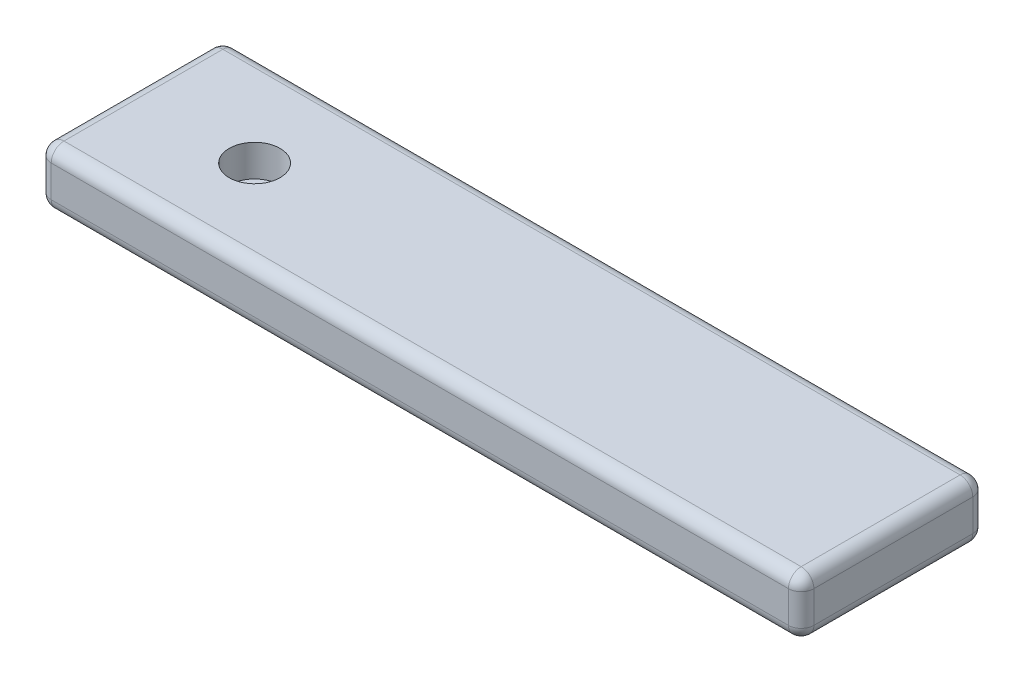
ISO-10303-21;
HEADER;
FILE_DESCRIPTION(('STEP AP214'),'2;1');
FILE_NAME('part.step','',(''),(''),'','','');
FILE_SCHEMA(('AUTOMOTIVE_DESIGN { 1 0 10303 214 1 1 1 1 }'));
ENDSEC;
DATA;
#1=APPLICATION_CONTEXT('core data for automotive mechanical design processes');
#2=APPLICATION_PROTOCOL_DEFINITION('international standard','automotive_design',2000,#1);
#3=PRODUCT_CONTEXT('',#1,'mechanical');
#4=PRODUCT('Part','Part','',(#3));
#5=PRODUCT_RELATED_PRODUCT_CATEGORY('part','',(#4));
#6=PRODUCT_DEFINITION_FORMATION('','',#4);
#7=PRODUCT_DEFINITION_CONTEXT('part definition',#1,'design');
#8=PRODUCT_DEFINITION('design','',#6,#7);
#9=PRODUCT_DEFINITION_SHAPE('','',#8);
#10=(LENGTH_UNIT() NAMED_UNIT(*) SI_UNIT(.MILLI.,.METRE.));
#11=(NAMED_UNIT(*) PLANE_ANGLE_UNIT() SI_UNIT($,.RADIAN.));
#12=(NAMED_UNIT(*) SI_UNIT($,.STERADIAN.) SOLID_ANGLE_UNIT());
#13=UNCERTAINTY_MEASURE_WITH_UNIT(LENGTH_MEASURE(1.E-05),#10,'distance_accuracy_value','');
#14=(GEOMETRIC_REPRESENTATION_CONTEXT(3) GLOBAL_UNCERTAINTY_ASSIGNED_CONTEXT((#13)) GLOBAL_UNIT_ASSIGNED_CONTEXT((#10,
#11,#12)) REPRESENTATION_CONTEXT('',''));
#15=CARTESIAN_POINT('',(0.,0.,0.));
#16=DIRECTION('',(0.,0.,1.));
#17=DIRECTION('',(1.,0.,0.));
#18=AXIS2_PLACEMENT_3D('',#15,#16,#17);
#19=CARTESIAN_POINT('',(76.2,0.,0.));
#20=DIRECTION('',(0.,0.,-1.));
#21=DIRECTION('',(-1.,0.,0.));
#22=AXIS2_PLACEMENT_3D('',#19,#20,#21);
#23=PLANE('',#22);
#24=DIRECTION('',(0.,-1.,0.));
#25=VECTOR('',#24,1.);
#26=CARTESIAN_POINT('',(74.93,0.,0.));
#27=LINE('',#26,#25);
#28=CARTESIAN_POINT('',(74.93,1.27,0.));
#29=VERTEX_POINT('',#28);
#30=CARTESIAN_POINT('',(74.93,4.445,0.));
#31=VERTEX_POINT('',#30);
#32=EDGE_CURVE('E166',#29,#31,#27,.F.);
#33=ORIENTED_EDGE('',*,*,#32,.T.);
#34=DIRECTION('',(-1.,0.,0.));
#35=VECTOR('',#34,1.);
#36=CARTESIAN_POINT('',(76.2,4.445,0.));
#37=LINE('',#36,#35);
#38=CARTESIAN_POINT('',(1.26999999999999,4.445,0.));
#39=VERTEX_POINT('',#38);
#40=EDGE_CURVE('E271',#31,#39,#37,.T.);
#41=ORIENTED_EDGE('',*,*,#40,.T.);
#42=DIRECTION('',(0.,-1.,0.));
#43=VECTOR('',#42,1.);
#44=CARTESIAN_POINT('',(1.26999999999999,0.,0.));
#45=LINE('',#44,#43);
#46=CARTESIAN_POINT('',(1.26999999999999,1.27,0.));
#47=VERTEX_POINT('',#46);
#48=EDGE_CURVE('E266',#39,#47,#45,.T.);
#49=ORIENTED_EDGE('',*,*,#48,.T.);
#50=DIRECTION('',(-1.,0.,0.));
#51=VECTOR('',#50,1.);
#52=CARTESIAN_POINT('',(76.2,1.27,0.));
#53=LINE('',#52,#51);
#54=EDGE_CURVE('E263',#47,#29,#53,.F.);
#55=ORIENTED_EDGE('',*,*,#54,.T.);
#56=EDGE_LOOP('',(#33,#41,#49,#55));
#57=FACE_BOUND('',#56,.T.);
#58=ADVANCED_FACE('F44',(#57),#23,.F.);
#59=CARTESIAN_POINT('',(76.2,0.,0.));
#60=DIRECTION('',(0.,1.,0.));
#61=DIRECTION('',(0.,0.,1.));
#62=AXIS2_PLACEMENT_3D('',#59,#60,#61);
#63=PLANE('',#62);
#64=DIRECTION('',(0.,0.,-1.));
#65=VECTOR('',#64,1.);
#66=CARTESIAN_POINT('',(74.93,0.,0.));
#67=LINE('',#66,#65);
#68=CARTESIAN_POINT('',(74.93,0.,-17.145));
#69=VERTEX_POINT('',#68);
#70=CARTESIAN_POINT('',(74.93,0.,-1.27));
#71=VERTEX_POINT('',#70);
#72=EDGE_CURVE('E54',#69,#71,#67,.F.);
#73=ORIENTED_EDGE('',*,*,#72,.T.);
#74=DIRECTION('',(-1.,0.,0.));
#75=VECTOR('',#74,1.);
#76=CARTESIAN_POINT('',(76.2,0.,-1.27));
#77=LINE('',#76,#75);
#78=CARTESIAN_POINT('',(1.26999999999999,0.,-1.27));
#79=VERTEX_POINT('',#78);
#80=EDGE_CURVE('E11',#71,#79,#77,.T.);
#81=ORIENTED_EDGE('',*,*,#80,.T.);
#82=DIRECTION('',(0.,0.,-1.));
#83=VECTOR('',#82,1.);
#84=CARTESIAN_POINT('',(1.26999999999999,0.,-18.415));
#85=LINE('',#84,#83);
#86=CARTESIAN_POINT('',(1.26999999999999,0.,-17.145));
#87=VERTEX_POINT('',#86);
#88=EDGE_CURVE('E302',#79,#87,#85,.T.);
#89=ORIENTED_EDGE('',*,*,#88,.T.);
#90=DIRECTION('',(-1.,0.,0.));
#91=VECTOR('',#90,1.);
#92=CARTESIAN_POINT('',(76.2,0.,-17.145));
#93=LINE('',#92,#91);
#94=EDGE_CURVE('E67',#87,#69,#93,.F.);
#95=ORIENTED_EDGE('',*,*,#94,.T.);
#96=EDGE_LOOP('',(#73,#81,#89,#95));
#97=FACE_BOUND('',#96,.T.);
#98=ADVANCED_FACE('F358',(#97),#63,.F.);
#99=CARTESIAN_POINT('',(76.2,0.,-18.415));
#100=DIRECTION('',(0.,0.,1.));
#101=DIRECTION('',(1.,0.,0.));
#102=AXIS2_PLACEMENT_3D('',#99,#100,#101);
#103=PLANE('',#102);
#104=DIRECTION('',(-1.,0.,0.));
#105=VECTOR('',#104,1.);
#106=CARTESIAN_POINT('',(76.2,4.445,-18.415));
#107=LINE('',#106,#105);
#108=CARTESIAN_POINT('',(1.26999999999999,4.445,-18.415));
#109=VERTEX_POINT('',#108);
#110=CARTESIAN_POINT('',(74.93,4.445,-18.415));
#111=VERTEX_POINT('',#110);
#112=EDGE_CURVE('E294',#109,#111,#107,.F.);
#113=ORIENTED_EDGE('',*,*,#112,.T.);
#114=DIRECTION('',(0.,1.,0.));
#115=VECTOR('',#114,1.);
#116=CARTESIAN_POINT('',(74.93,0.,-18.415));
#117=LINE('',#116,#115);
#118=CARTESIAN_POINT('',(74.93,1.27,-18.415));
#119=VERTEX_POINT('',#118);
#120=EDGE_CURVE('E299',#111,#119,#117,.F.);
#121=ORIENTED_EDGE('',*,*,#120,.T.);
#122=DIRECTION('',(-1.,0.,0.));
#123=VECTOR('',#122,1.);
#124=CARTESIAN_POINT('',(76.2,1.27,-18.415));
#125=LINE('',#124,#123);
#126=CARTESIAN_POINT('',(1.26999999999999,1.27,-18.415));
#127=VERTEX_POINT('',#126);
#128=EDGE_CURVE('E288',#119,#127,#125,.T.);
#129=ORIENTED_EDGE('',*,*,#128,.T.);
#130=DIRECTION('',(0.,1.,0.));
#131=VECTOR('',#130,1.);
#132=CARTESIAN_POINT('',(1.26999999999999,5.715,-18.415));
#133=LINE('',#132,#131);
#134=EDGE_CURVE('E292',#127,#109,#133,.T.);
#135=ORIENTED_EDGE('',*,*,#134,.T.);
#136=EDGE_LOOP('',(#113,#121,#129,#135));
#137=FACE_BOUND('',#136,.T.);
#138=ADVANCED_FACE('F372',(#137),#103,.F.);
#139=CARTESIAN_POINT('',(76.2,5.715,0.));
#140=DIRECTION('',(0.,-1.,0.));
#141=DIRECTION('',(0.,0.,-1.));
#142=AXIS2_PLACEMENT_3D('',#139,#140,#141);
#143=PLANE('',#142);
#144=DIRECTION('',(-1.,0.,0.));
#145=VECTOR('',#144,1.);
#146=CARTESIAN_POINT('',(76.2,5.715,-1.27));
#147=LINE('',#146,#145);
#148=CARTESIAN_POINT('',(1.26999999999999,5.715,-1.27));
#149=VERTEX_POINT('',#148);
#150=CARTESIAN_POINT('',(74.93,5.715,-1.27));
#151=VERTEX_POINT('',#150);
#152=EDGE_CURVE('E258',#149,#151,#147,.F.);
#153=ORIENTED_EDGE('',*,*,#152,.T.);
#154=DIRECTION('',(0.,0.,1.));
#155=VECTOR('',#154,1.);
#156=CARTESIAN_POINT('',(74.93,5.715,0.));
#157=LINE('',#156,#155);
#158=CARTESIAN_POINT('',(74.93,5.715,-17.145));
#159=VERTEX_POINT('',#158);
#160=EDGE_CURVE('E259',#151,#159,#157,.F.);
#161=ORIENTED_EDGE('',*,*,#160,.T.);
#162=DIRECTION('',(-1.,0.,0.));
#163=VECTOR('',#162,1.);
#164=CARTESIAN_POINT('',(76.2,5.715,-17.145));
#165=LINE('',#164,#163);
#166=CARTESIAN_POINT('',(1.26999999999999,5.715,-17.145));
#167=VERTEX_POINT('',#166);
#168=EDGE_CURVE('E246',#159,#167,#165,.T.);
#169=ORIENTED_EDGE('',*,*,#168,.T.);
#170=DIRECTION('',(0.,0.,1.));
#171=VECTOR('',#170,1.);
#172=CARTESIAN_POINT('',(1.26999999999999,5.715,0.));
#173=LINE('',#172,#171);
#174=EDGE_CURVE('E251',#167,#149,#173,.T.);
#175=ORIENTED_EDGE('',*,*,#174,.T.);
#176=EDGE_LOOP('',(#153,#161,#169,#175));
#177=FACE_BOUND('',#176,.T.);
#178=CARTESIAN_POINT('',(12.7,5.715,-8.89));
#179=DIRECTION('',(0.,1.,0.));
#180=DIRECTION('',(0.,0.,1.));
#181=AXIS2_PLACEMENT_3D('',#178,#179,#180);
#182=CIRCLE('',#181,2.54);
#183=CARTESIAN_POINT('',(12.7,5.715,-6.35));
#184=VERTEX_POINT('',#183);
#185=EDGE_CURVE('E235',#184,#184,#182,.T.);
#186=ORIENTED_EDGE('',*,*,#185,.F.);
#187=EDGE_LOOP('',(#186));
#188=FACE_BOUND('',#187,.T.);
#189=ADVANCED_FACE('F338',(#177,#188),#143,.F.);
#190=CARTESIAN_POINT('',(76.2,0.,0.));
#191=DIRECTION('',(-1.,0.,0.));
#192=DIRECTION('',(0.,0.,1.));
#193=AXIS2_PLACEMENT_3D('',#190,#191,#192);
#194=PLANE('',#193);
#195=DIRECTION('',(0.,1.,0.));
#196=VECTOR('',#195,1.);
#197=CARTESIAN_POINT('',(76.2,0.,-17.145));
#198=LINE('',#197,#196);
#199=CARTESIAN_POINT('',(76.2,1.27,-17.145));
#200=VERTEX_POINT('',#199);
#201=CARTESIAN_POINT('',(76.2,4.445,-17.145));
#202=VERTEX_POINT('',#201);
#203=EDGE_CURVE('E144',#200,#202,#198,.T.);
#204=ORIENTED_EDGE('',*,*,#203,.T.);
#205=DIRECTION('',(0.,0.,1.));
#206=VECTOR('',#205,1.);
#207=CARTESIAN_POINT('',(76.2,4.445,0.));
#208=LINE('',#207,#206);
#209=CARTESIAN_POINT('',(76.2,4.445,-1.27));
#210=VERTEX_POINT('',#209);
#211=EDGE_CURVE('E136',#202,#210,#208,.T.);
#212=ORIENTED_EDGE('',*,*,#211,.T.);
#213=DIRECTION('',(0.,-1.,0.));
#214=VECTOR('',#213,1.);
#215=CARTESIAN_POINT('',(76.2,0.,-1.27));
#216=LINE('',#215,#214);
#217=CARTESIAN_POINT('',(76.2,1.27,-1.27));
#218=VERTEX_POINT('',#217);
#219=EDGE_CURVE('E131',#210,#218,#216,.T.);
#220=ORIENTED_EDGE('',*,*,#219,.T.);
#221=DIRECTION('',(0.,0.,-1.));
#222=VECTOR('',#221,1.);
#223=CARTESIAN_POINT('',(76.2,1.27,0.));
#224=LINE('',#223,#222);
#225=EDGE_CURVE('E140',#218,#200,#224,.T.);
#226=ORIENTED_EDGE('',*,*,#225,.T.);
#227=EDGE_LOOP('',(#204,#212,#220,#226));
#228=FACE_BOUND('',#227,.T.);
#229=ADVANCED_FACE('F137',(#228),#194,.F.);
#230=CARTESIAN_POINT('',(0.,0.,0.));
#231=DIRECTION('',(-1.,0.,0.));
#232=DIRECTION('',(0.,0.,1.));
#233=AXIS2_PLACEMENT_3D('',#230,#231,#232);
#234=PLANE('',#233);
#235=DIRECTION('',(0.,-1.,0.));
#236=VECTOR('',#235,1.);
#237=CARTESIAN_POINT('',(0.,5.715,-1.27));
#238=LINE('',#237,#236);
#239=CARTESIAN_POINT('',(0.,1.27,-1.27));
#240=VERTEX_POINT('',#239);
#241=CARTESIAN_POINT('',(0.,4.445,-1.27));
#242=VERTEX_POINT('',#241);
#243=EDGE_CURVE('E282',#240,#242,#238,.F.);
#244=ORIENTED_EDGE('',*,*,#243,.T.);
#245=DIRECTION('',(0.,0.,1.));
#246=VECTOR('',#245,1.);
#247=CARTESIAN_POINT('',(0.,4.445,-18.415));
#248=LINE('',#247,#246);
#249=CARTESIAN_POINT('',(0.,4.445,-17.145));
#250=VERTEX_POINT('',#249);
#251=EDGE_CURVE('E281',#242,#250,#248,.F.);
#252=ORIENTED_EDGE('',*,*,#251,.T.);
#253=DIRECTION('',(0.,1.,0.));
#254=VECTOR('',#253,1.);
#255=CARTESIAN_POINT('',(0.,0.,-17.145));
#256=LINE('',#255,#254);
#257=CARTESIAN_POINT('',(0.,1.27,-17.145));
#258=VERTEX_POINT('',#257);
#259=EDGE_CURVE('E279',#250,#258,#256,.F.);
#260=ORIENTED_EDGE('',*,*,#259,.T.);
#261=DIRECTION('',(0.,0.,-1.));
#262=VECTOR('',#261,1.);
#263=CARTESIAN_POINT('',(0.,1.27,0.));
#264=LINE('',#263,#262);
#265=EDGE_CURVE('E274',#258,#240,#264,.F.);
#266=ORIENTED_EDGE('',*,*,#265,.T.);
#267=EDGE_LOOP('',(#244,#252,#260,#266));
#268=FACE_BOUND('',#267,.T.);
#269=ADVANCED_FACE('F572',(#268),#234,.T.);
#270=CARTESIAN_POINT('',(12.7,2.54,-8.89));
#271=DIRECTION('',(0.,1.,0.));
#272=DIRECTION('',(0.,0.,1.));
#273=AXIS2_PLACEMENT_3D('',#270,#271,#272);
#274=CYLINDRICAL_SURFACE('',#273,2.54);
#275=CARTESIAN_POINT('',(12.7,2.54,-8.89));
#276=DIRECTION('',(0.,1.,0.));
#277=DIRECTION('',(0.,0.,1.));
#278=AXIS2_PLACEMENT_3D('',#275,#276,#277);
#279=CIRCLE('',#278,2.54);
#280=CARTESIAN_POINT('',(12.7,2.54,-6.35));
#281=VERTEX_POINT('',#280);
#282=EDGE_CURVE('E160',#281,#281,#279,.T.);
#283=ORIENTED_EDGE('',*,*,#282,.F.);
#284=EDGE_LOOP('',(#283));
#285=FACE_BOUND('',#284,.T.);
#286=ORIENTED_EDGE('',*,*,#185,.T.);
#287=EDGE_LOOP('',(#286));
#288=FACE_BOUND('',#287,.T.);
#289=ADVANCED_FACE('F565',(#285,#288),#274,.F.);
#290=CARTESIAN_POINT('',(12.7,2.54,-8.89));
#291=DIRECTION('',(0.,1.,0.));
#292=DIRECTION('',(0.,0.,1.));
#293=AXIS2_PLACEMENT_3D('',#290,#291,#292);
#294=PLANE('',#293);
#295=ORIENTED_EDGE('',*,*,#282,.T.);
#296=EDGE_LOOP('',(#295));
#297=FACE_BOUND('',#296,.T.);
#298=ADVANCED_FACE('F557',(#297),#294,.T.);
#299=CARTESIAN_POINT('',(1.26999999999999,1.27,0.));
#300=DIRECTION('',(0.,0.,1.));
#301=DIRECTION('',(1.,0.,0.));
#302=AXIS2_PLACEMENT_3D('',#299,#300,#301);
#303=CYLINDRICAL_SURFACE('',#302,1.27);
#304=CARTESIAN_POINT('',(1.26999999999999,1.27,-17.145));
#305=DIRECTION('',(0.,0.,-1.));
#306=DIRECTION('',(-1.,0.,0.));
#307=AXIS2_PLACEMENT_3D('',#304,#305,#306);
#308=CIRCLE('',#307,1.27);
#309=EDGE_CURVE('E47',#87,#258,#308,.T.);
#310=ORIENTED_EDGE('',*,*,#309,.F.);
#311=ORIENTED_EDGE('',*,*,#88,.F.);
#312=CARTESIAN_POINT('',(1.27,1.27,-1.27));
#313=DIRECTION('',(0.,0.,1.));
#314=DIRECTION('',(0.,-1.,0.));
#315=AXIS2_PLACEMENT_3D('',#312,#313,#314);
#316=CIRCLE('',#315,1.27);
#317=EDGE_CURVE('E225',#240,#79,#316,.T.);
#318=ORIENTED_EDGE('',*,*,#317,.F.);
#319=ORIENTED_EDGE('',*,*,#265,.F.);
#320=EDGE_LOOP('',(#310,#311,#318,#319));
#321=FACE_BOUND('',#320,.T.);
#322=ADVANCED_FACE('F50',(#321),#303,.T.);
#323=CARTESIAN_POINT('',(1.27,1.27,-17.145));
#324=DIRECTION('',(-1.,0.,0.));
#325=DIRECTION('',(0.,0.,1.));
#326=AXIS2_PLACEMENT_3D('',#323,#324,#325);
#327=SPHERICAL_SURFACE('',#326,1.27);
#328=CARTESIAN_POINT('',(1.26999999999999,1.27,-17.145));
#329=DIRECTION('',(-1.,0.,0.));
#330=DIRECTION('',(0.,0.,1.));
#331=AXIS2_PLACEMENT_3D('',#328,#329,#330);
#332=CIRCLE('',#331,1.27);
#333=EDGE_CURVE('E214',#87,#127,#332,.F.);
#334=ORIENTED_EDGE('',*,*,#333,.F.);
#335=ORIENTED_EDGE('',*,*,#309,.T.);
#336=CARTESIAN_POINT('',(1.27,1.27,-17.145));
#337=DIRECTION('',(0.,-1.,0.));
#338=DIRECTION('',(0.,0.,-1.));
#339=AXIS2_PLACEMENT_3D('',#336,#337,#338);
#340=CIRCLE('',#339,1.27);
#341=EDGE_CURVE('E218',#127,#258,#340,.F.);
#342=ORIENTED_EDGE('',*,*,#341,.F.);
#343=EDGE_LOOP('',(#334,#335,#342));
#344=FACE_BOUND('',#343,.T.);
#345=ADVANCED_FACE('F363',(#344),#327,.T.);
#346=CARTESIAN_POINT('',(1.27,1.27,-1.27));
#347=DIRECTION('',(0.,-1.,0.));
#348=DIRECTION('',(1.,0.,0.));
#349=AXIS2_PLACEMENT_3D('',#346,#347,#348);
#350=SPHERICAL_SURFACE('',#349,1.27);
#351=CARTESIAN_POINT('',(1.26999999999999,1.27,-1.27));
#352=DIRECTION('',(0.,-1.,0.));
#353=DIRECTION('',(0.,0.,-1.));
#354=AXIS2_PLACEMENT_3D('',#351,#352,#353);
#355=CIRCLE('',#354,1.27);
#356=EDGE_CURVE('E208',#240,#47,#355,.F.);
#357=ORIENTED_EDGE('',*,*,#356,.F.);
#358=ORIENTED_EDGE('',*,*,#317,.T.);
#359=CARTESIAN_POINT('',(1.26999999999999,1.27,-1.27));
#360=DIRECTION('',(-1.,0.,0.));
#361=DIRECTION('',(0.,0.,1.));
#362=AXIS2_PLACEMENT_3D('',#359,#360,#361);
#363=CIRCLE('',#362,1.27);
#364=EDGE_CURVE('E215',#47,#79,#363,.F.);
#365=ORIENTED_EDGE('',*,*,#364,.F.);
#366=EDGE_LOOP('',(#357,#358,#365));
#367=FACE_BOUND('',#366,.T.);
#368=ADVANCED_FACE('F394',(#367),#350,.T.);
#369=CARTESIAN_POINT('',(1.26999999999999,0.,-17.145));
#370=DIRECTION('',(0.,-1.,0.));
#371=DIRECTION('',(0.,0.,-1.));
#372=AXIS2_PLACEMENT_3D('',#369,#370,#371);
#373=CYLINDRICAL_SURFACE('',#372,1.27);
#374=ORIENTED_EDGE('',*,*,#341,.T.);
#375=ORIENTED_EDGE('',*,*,#259,.F.);
#376=CARTESIAN_POINT('',(1.26999999999999,4.445,-17.145));
#377=DIRECTION('',(0.,1.,0.));
#378=DIRECTION('',(0.,0.,1.));
#379=AXIS2_PLACEMENT_3D('',#376,#377,#378);
#380=CIRCLE('',#379,1.27);
#381=EDGE_CURVE('E203',#109,#250,#380,.T.);
#382=ORIENTED_EDGE('',*,*,#381,.F.);
#383=ORIENTED_EDGE('',*,*,#134,.F.);
#384=EDGE_LOOP('',(#374,#375,#382,#383));
#385=FACE_BOUND('',#384,.T.);
#386=ADVANCED_FACE('F378',(#385),#373,.T.);
#387=CARTESIAN_POINT('',(76.2,1.27,-17.145));
#388=DIRECTION('',(-1.,0.,0.));
#389=DIRECTION('',(0.,0.,1.));
#390=AXIS2_PLACEMENT_3D('',#387,#388,#389);
#391=CYLINDRICAL_SURFACE('',#390,1.27);
#392=ORIENTED_EDGE('',*,*,#333,.T.);
#393=ORIENTED_EDGE('',*,*,#128,.F.);
#394=CARTESIAN_POINT('',(74.93,1.27,-17.145));
#395=DIRECTION('',(1.,0.,0.));
#396=DIRECTION('',(0.,0.,-1.));
#397=AXIS2_PLACEMENT_3D('',#394,#395,#396);
#398=CIRCLE('',#397,1.27);
#399=EDGE_CURVE('E197',#69,#119,#398,.T.);
#400=ORIENTED_EDGE('',*,*,#399,.F.);
#401=ORIENTED_EDGE('',*,*,#94,.F.);
#402=EDGE_LOOP('',(#392,#393,#400,#401));
#403=FACE_BOUND('',#402,.T.);
#404=ADVANCED_FACE('F368',(#403),#391,.T.);
#405=CARTESIAN_POINT('',(74.93,1.27,0.));
#406=DIRECTION('',(0.,0.,-1.));
#407=DIRECTION('',(-1.,0.,0.));
#408=AXIS2_PLACEMENT_3D('',#405,#406,#407);
#409=CYLINDRICAL_SURFACE('',#408,1.27);
#410=CARTESIAN_POINT('',(74.93,1.27,-1.27));
#411=DIRECTION('',(0.,0.,1.));
#412=DIRECTION('',(1.,0.,0.));
#413=AXIS2_PLACEMENT_3D('',#410,#411,#412);
#414=CIRCLE('',#413,1.27);
#415=EDGE_CURVE('E151',#71,#218,#414,.T.);
#416=ORIENTED_EDGE('',*,*,#415,.F.);
#417=ORIENTED_EDGE('',*,*,#72,.F.);
#418=CARTESIAN_POINT('',(74.93,1.27,-17.145));
#419=DIRECTION('',(0.,0.,-1.));
#420=DIRECTION('',(-1.,0.,0.));
#421=AXIS2_PLACEMENT_3D('',#418,#419,#420);
#422=CIRCLE('',#421,1.27);
#423=EDGE_CURVE('E152',#200,#69,#422,.T.);
#424=ORIENTED_EDGE('',*,*,#423,.F.);
#425=ORIENTED_EDGE('',*,*,#225,.F.);
#426=EDGE_LOOP('',(#416,#417,#424,#425));
#427=FACE_BOUND('',#426,.T.);
#428=ADVANCED_FACE('F147',(#427),#409,.T.);
#429=CARTESIAN_POINT('',(76.2,1.27,-1.27));
#430=DIRECTION('',(-1.,0.,0.));
#431=DIRECTION('',(0.,0.,1.));
#432=AXIS2_PLACEMENT_3D('',#429,#430,#431);
#433=CYLINDRICAL_SURFACE('',#432,1.27);
#434=ORIENTED_EDGE('',*,*,#364,.T.);
#435=ORIENTED_EDGE('',*,*,#80,.F.);
#436=CARTESIAN_POINT('',(74.93,1.27,-1.27));
#437=DIRECTION('',(1.,0.,0.));
#438=DIRECTION('',(0.,0.,-1.));
#439=AXIS2_PLACEMENT_3D('',#436,#437,#438);
#440=CIRCLE('',#439,1.27);
#441=EDGE_CURVE('E164',#29,#71,#440,.T.);
#442=ORIENTED_EDGE('',*,*,#441,.F.);
#443=ORIENTED_EDGE('',*,*,#54,.F.);
#444=EDGE_LOOP('',(#434,#435,#442,#443));
#445=FACE_BOUND('',#444,.T.);
#446=ADVANCED_FACE('F360',(#445),#433,.T.);
#447=CARTESIAN_POINT('',(1.26999999999999,0.,-1.27));
#448=DIRECTION('',(0.,1.,0.));
#449=DIRECTION('',(0.,0.,1.));
#450=AXIS2_PLACEMENT_3D('',#447,#448,#449);
#451=CYLINDRICAL_SURFACE('',#450,1.27);
#452=ORIENTED_EDGE('',*,*,#356,.T.);
#453=ORIENTED_EDGE('',*,*,#48,.F.);
#454=CARTESIAN_POINT('',(1.27,4.445,-1.27));
#455=DIRECTION('',(0.,1.,0.));
#456=DIRECTION('',(0.,0.,1.));
#457=AXIS2_PLACEMENT_3D('',#454,#455,#456);
#458=CIRCLE('',#457,1.27);
#459=EDGE_CURVE('E186',#242,#39,#458,.T.);
#460=ORIENTED_EDGE('',*,*,#459,.F.);
#461=ORIENTED_EDGE('',*,*,#243,.F.);
#462=EDGE_LOOP('',(#452,#453,#460,#461));
#463=FACE_BOUND('',#462,.T.);
#464=ADVANCED_FACE('F392',(#463),#451,.T.);
#465=CARTESIAN_POINT('',(1.26999999999999,4.445,0.));
#466=DIRECTION('',(0.,0.,-1.));
#467=DIRECTION('',(-1.,0.,0.));
#468=AXIS2_PLACEMENT_3D('',#465,#466,#467);
#469=CYLINDRICAL_SURFACE('',#468,1.27);
#470=CARTESIAN_POINT('',(1.27,4.445,-17.145));
#471=DIRECTION('',(0.,0.,-1.));
#472=DIRECTION('',(0.,1.,0.));
#473=AXIS2_PLACEMENT_3D('',#470,#471,#472);
#474=CIRCLE('',#473,1.27);
#475=EDGE_CURVE('E204',#250,#167,#474,.T.);
#476=ORIENTED_EDGE('',*,*,#475,.F.);
#477=ORIENTED_EDGE('',*,*,#251,.F.);
#478=CARTESIAN_POINT('',(1.26999999999999,4.445,-1.27));
#479=DIRECTION('',(0.,0.,1.));
#480=DIRECTION('',(1.,0.,0.));
#481=AXIS2_PLACEMENT_3D('',#478,#479,#480);
#482=CIRCLE('',#481,1.27);
#483=EDGE_CURVE('E183',#149,#242,#482,.T.);
#484=ORIENTED_EDGE('',*,*,#483,.F.);
#485=ORIENTED_EDGE('',*,*,#174,.F.);
#486=EDGE_LOOP('',(#476,#477,#484,#485));
#487=FACE_BOUND('',#486,.T.);
#488=ADVANCED_FACE('F383',(#487),#469,.T.);
#489=CARTESIAN_POINT('',(1.27,4.445,-17.145));
#490=DIRECTION('',(-1.,0.,0.));
#491=DIRECTION('',(0.,0.,1.));
#492=AXIS2_PLACEMENT_3D('',#489,#490,#491);
#493=SPHERICAL_SURFACE('',#492,1.27);
#494=ORIENTED_EDGE('',*,*,#381,.T.);
#495=ORIENTED_EDGE('',*,*,#475,.T.);
#496=CARTESIAN_POINT('',(1.26999999999999,4.445,-17.145));
#497=DIRECTION('',(-1.,0.,0.));
#498=DIRECTION('',(0.,0.,1.));
#499=AXIS2_PLACEMENT_3D('',#496,#497,#498);
#500=CIRCLE('',#499,1.27);
#501=EDGE_CURVE('E177',#109,#167,#500,.F.);
#502=ORIENTED_EDGE('',*,*,#501,.F.);
#503=EDGE_LOOP('',(#494,#495,#502));
#504=FACE_BOUND('',#503,.T.);
#505=ADVANCED_FACE('F381',(#504),#493,.T.);
#506=CARTESIAN_POINT('',(74.93,1.27,-17.145));
#507=DIRECTION('',(0.,-1.,0.));
#508=DIRECTION('',(0.,0.,-1.));
#509=AXIS2_PLACEMENT_3D('',#506,#507,#508);
#510=SPHERICAL_SURFACE('',#509,1.27);
#511=ORIENTED_EDGE('',*,*,#423,.T.);
#512=ORIENTED_EDGE('',*,*,#399,.T.);
#513=CARTESIAN_POINT('',(74.93,1.27,-17.145));
#514=DIRECTION('',(0.,-1.,0.));
#515=DIRECTION('',(1.,0.,0.));
#516=AXIS2_PLACEMENT_3D('',#513,#514,#515);
#517=CIRCLE('',#516,1.27);
#518=EDGE_CURVE('E172',#200,#119,#517,.F.);
#519=ORIENTED_EDGE('',*,*,#518,.F.);
#520=EDGE_LOOP('',(#511,#512,#519));
#521=FACE_BOUND('',#520,.T.);
#522=ADVANCED_FACE('F366',(#521),#510,.T.);
#523=CARTESIAN_POINT('',(74.93,1.27,-1.27));
#524=DIRECTION('',(0.,-1.,0.));
#525=DIRECTION('',(0.,0.,-1.));
#526=AXIS2_PLACEMENT_3D('',#523,#524,#525);
#527=SPHERICAL_SURFACE('',#526,1.27);
#528=ORIENTED_EDGE('',*,*,#441,.T.);
#529=ORIENTED_EDGE('',*,*,#415,.T.);
#530=CARTESIAN_POINT('',(74.93,1.27,-1.27));
#531=DIRECTION('',(0.,-1.,0.));
#532=DIRECTION('',(0.,0.,-1.));
#533=AXIS2_PLACEMENT_3D('',#530,#531,#532);
#534=CIRCLE('',#533,1.27);
#535=EDGE_CURVE('E165',#29,#218,#534,.F.);
#536=ORIENTED_EDGE('',*,*,#535,.F.);
#537=EDGE_LOOP('',(#528,#529,#536));
#538=FACE_BOUND('',#537,.T.);
#539=ADVANCED_FACE('F161',(#538),#527,.T.);
#540=CARTESIAN_POINT('',(1.27,4.445,-1.27));
#541=DIRECTION('',(-1.,0.,0.));
#542=DIRECTION('',(0.,0.,1.));
#543=AXIS2_PLACEMENT_3D('',#540,#541,#542);
#544=SPHERICAL_SURFACE('',#543,1.27);
#545=ORIENTED_EDGE('',*,*,#483,.T.);
#546=ORIENTED_EDGE('',*,*,#459,.T.);
#547=CARTESIAN_POINT('',(1.26999999999999,4.445,-1.27));
#548=DIRECTION('',(-1.,0.,0.));
#549=DIRECTION('',(0.,0.,1.));
#550=AXIS2_PLACEMENT_3D('',#547,#548,#549);
#551=CIRCLE('',#550,1.27);
#552=EDGE_CURVE('E174',#149,#39,#551,.F.);
#553=ORIENTED_EDGE('',*,*,#552,.F.);
#554=EDGE_LOOP('',(#545,#546,#553));
#555=FACE_BOUND('',#554,.T.);
#556=ADVANCED_FACE('F389',(#555),#544,.T.);
#557=CARTESIAN_POINT('',(76.2,4.445,-17.145));
#558=DIRECTION('',(-1.,0.,0.));
#559=DIRECTION('',(0.,0.,1.));
#560=AXIS2_PLACEMENT_3D('',#557,#558,#559);
#561=CYLINDRICAL_SURFACE('',#560,1.27);
#562=ORIENTED_EDGE('',*,*,#501,.T.);
#563=ORIENTED_EDGE('',*,*,#168,.F.);
#564=CARTESIAN_POINT('',(74.93,4.445,-17.145));
#565=DIRECTION('',(1.,0.,0.));
#566=DIRECTION('',(0.,0.,-1.));
#567=AXIS2_PLACEMENT_3D('',#564,#565,#566);
#568=CIRCLE('',#567,1.27);
#569=EDGE_CURVE('E178',#111,#159,#568,.T.);
#570=ORIENTED_EDGE('',*,*,#569,.F.);
#571=ORIENTED_EDGE('',*,*,#112,.F.);
#572=EDGE_LOOP('',(#562,#563,#570,#571));
#573=FACE_BOUND('',#572,.T.);
#574=ADVANCED_FACE('F333',(#573),#561,.T.);
#575=CARTESIAN_POINT('',(74.93,0.,-17.145));
#576=DIRECTION('',(0.,1.,0.));
#577=DIRECTION('',(0.,0.,1.));
#578=AXIS2_PLACEMENT_3D('',#575,#576,#577);
#579=CYLINDRICAL_SURFACE('',#578,1.27);
#580=ORIENTED_EDGE('',*,*,#518,.T.);
#581=ORIENTED_EDGE('',*,*,#120,.F.);
#582=CARTESIAN_POINT('',(74.93,4.445,-17.145));
#583=DIRECTION('',(0.,1.,0.));
#584=DIRECTION('',(0.,0.,1.));
#585=AXIS2_PLACEMENT_3D('',#582,#583,#584);
#586=CIRCLE('',#585,1.27);
#587=EDGE_CURVE('E325',#202,#111,#586,.T.);
#588=ORIENTED_EDGE('',*,*,#587,.F.);
#589=ORIENTED_EDGE('',*,*,#203,.F.);
#590=EDGE_LOOP('',(#580,#581,#588,#589));
#591=FACE_BOUND('',#590,.T.);
#592=ADVANCED_FACE('F375',(#591),#579,.T.);
#593=CARTESIAN_POINT('',(74.93,0.,-1.27));
#594=DIRECTION('',(0.,-1.,0.));
#595=DIRECTION('',(0.,0.,-1.));
#596=AXIS2_PLACEMENT_3D('',#593,#594,#595);
#597=CYLINDRICAL_SURFACE('',#596,1.27);
#598=ORIENTED_EDGE('',*,*,#535,.T.);
#599=ORIENTED_EDGE('',*,*,#219,.F.);
#600=CARTESIAN_POINT('',(74.93,4.445,-1.27));
#601=DIRECTION('',(0.,1.,0.));
#602=DIRECTION('',(-1.,0.,0.));
#603=AXIS2_PLACEMENT_3D('',#600,#601,#602);
#604=CIRCLE('',#603,1.27);
#605=EDGE_CURVE('E318',#31,#210,#604,.T.);
#606=ORIENTED_EDGE('',*,*,#605,.F.);
#607=ORIENTED_EDGE('',*,*,#32,.F.);
#608=EDGE_LOOP('',(#598,#599,#606,#607));
#609=FACE_BOUND('',#608,.T.);
#610=ADVANCED_FACE('F169',(#609),#597,.T.);
#611=CARTESIAN_POINT('',(76.2,4.445,-1.27));
#612=DIRECTION('',(-1.,0.,0.));
#613=DIRECTION('',(0.,0.,1.));
#614=AXIS2_PLACEMENT_3D('',#611,#612,#613);
#615=CYLINDRICAL_SURFACE('',#614,1.27);
#616=ORIENTED_EDGE('',*,*,#552,.T.);
#617=ORIENTED_EDGE('',*,*,#40,.F.);
#618=CARTESIAN_POINT('',(74.93,4.445,-1.27));
#619=DIRECTION('',(1.,0.,0.));
#620=DIRECTION('',(0.,0.,-1.));
#621=AXIS2_PLACEMENT_3D('',#618,#619,#620);
#622=CIRCLE('',#621,1.27);
#623=EDGE_CURVE('E314',#151,#31,#622,.T.);
#624=ORIENTED_EDGE('',*,*,#623,.F.);
#625=ORIENTED_EDGE('',*,*,#152,.F.);
#626=EDGE_LOOP('',(#616,#617,#624,#625));
#627=FACE_BOUND('',#626,.T.);
#628=ADVANCED_FACE('F352',(#627),#615,.T.);
#629=CARTESIAN_POINT('',(74.93,4.445,-17.145));
#630=DIRECTION('',(0.,0.,-1.));
#631=DIRECTION('',(-1.,0.,0.));
#632=AXIS2_PLACEMENT_3D('',#629,#630,#631);
#633=SPHERICAL_SURFACE('',#632,1.27);
#634=ORIENTED_EDGE('',*,*,#587,.T.);
#635=ORIENTED_EDGE('',*,*,#569,.T.);
#636=CARTESIAN_POINT('',(74.93,4.445,-17.145));
#637=DIRECTION('',(0.,0.,-1.));
#638=DIRECTION('',(-1.,0.,0.));
#639=AXIS2_PLACEMENT_3D('',#636,#637,#638);
#640=CIRCLE('',#639,1.27);
#641=EDGE_CURVE('E313',#202,#159,#640,.F.);
#642=ORIENTED_EDGE('',*,*,#641,.F.);
#643=EDGE_LOOP('',(#634,#635,#642));
#644=FACE_BOUND('',#643,.T.);
#645=ADVANCED_FACE('F332',(#644),#633,.T.);
#646=CARTESIAN_POINT('',(74.93,4.445,-1.27));
#647=DIRECTION('',(0.,0.,1.));
#648=DIRECTION('',(0.,-1.,0.));
#649=AXIS2_PLACEMENT_3D('',#646,#647,#648);
#650=SPHERICAL_SURFACE('',#649,1.27);
#651=ORIENTED_EDGE('',*,*,#623,.T.);
#652=ORIENTED_EDGE('',*,*,#605,.T.);
#653=CARTESIAN_POINT('',(74.93,4.445,-1.27));
#654=DIRECTION('',(0.,0.,1.));
#655=DIRECTION('',(1.,0.,0.));
#656=AXIS2_PLACEMENT_3D('',#653,#654,#655);
#657=CIRCLE('',#656,1.27);
#658=EDGE_CURVE('E306',#151,#210,#657,.F.);
#659=ORIENTED_EDGE('',*,*,#658,.F.);
#660=EDGE_LOOP('',(#651,#652,#659));
#661=FACE_BOUND('',#660,.T.);
#662=ADVANCED_FACE('F346',(#661),#650,.T.);
#663=CARTESIAN_POINT('',(74.93,4.445,0.));
#664=DIRECTION('',(0.,0.,1.));
#665=DIRECTION('',(1.,0.,0.));
#666=AXIS2_PLACEMENT_3D('',#663,#664,#665);
#667=CYLINDRICAL_SURFACE('',#666,1.27);
#668=ORIENTED_EDGE('',*,*,#641,.T.);
#669=ORIENTED_EDGE('',*,*,#160,.F.);
#670=ORIENTED_EDGE('',*,*,#658,.T.);
#671=ORIENTED_EDGE('',*,*,#211,.F.);
#672=EDGE_LOOP('',(#668,#669,#670,#671));
#673=FACE_BOUND('',#672,.T.);
#674=ADVANCED_FACE('F347',(#673),#667,.T.);
#675=CLOSED_SHELL('',(#58,#98,#138,#189,#229,#269,#289,#298,#322,#345,#368,#386,#404,#428,#446,
#464,#488,#505,#522,#539,#556,#574,#592,#610,#628,#645,#662,#674));
#676=MANIFOLD_SOLID_BREP('B2',#675);
#677=ADVANCED_BREP_SHAPE_REPRESENTATION('',(#18,#676),#14);
#678=SHAPE_DEFINITION_REPRESENTATION(#9,#677);
ENDSEC;
END-ISO-10303-21;
